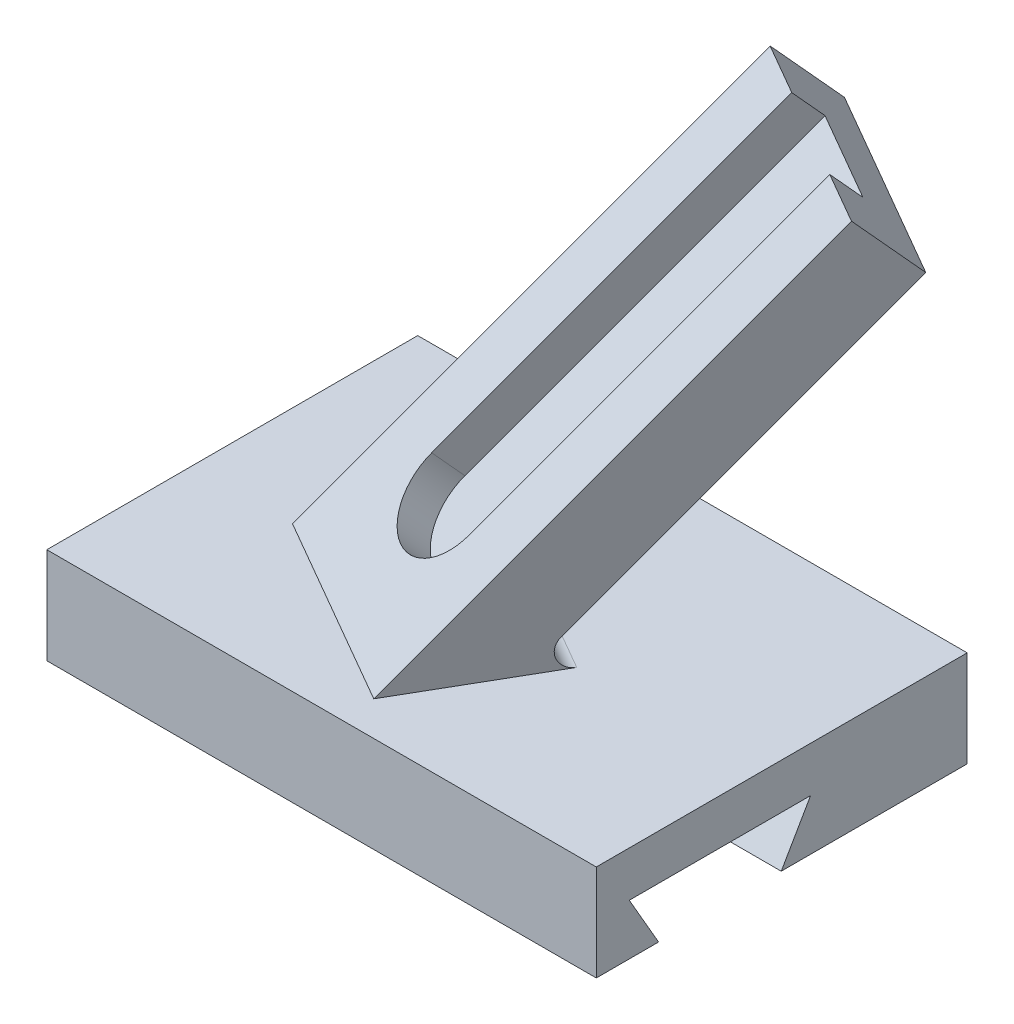
ISO-10303-21;
HEADER;
FILE_DESCRIPTION(('STEP AP214'),'2;1');
FILE_NAME('part.step','',(''),(''),'','','');
FILE_SCHEMA(('AUTOMOTIVE_DESIGN { 1 0 10303 214 1 1 1 1 }'));
ENDSEC;
DATA;
#1=APPLICATION_CONTEXT('core data for automotive mechanical design processes');
#2=APPLICATION_PROTOCOL_DEFINITION('international standard','automotive_design',2000,#1);
#3=PRODUCT_CONTEXT('',#1,'mechanical');
#4=PRODUCT('Part','Part','',(#3));
#5=PRODUCT_RELATED_PRODUCT_CATEGORY('part','',(#4));
#6=PRODUCT_DEFINITION_FORMATION('','',#4);
#7=PRODUCT_DEFINITION_CONTEXT('part definition',#1,'design');
#8=PRODUCT_DEFINITION('design','',#6,#7);
#9=PRODUCT_DEFINITION_SHAPE('','',#8);
#10=(LENGTH_UNIT() NAMED_UNIT(*) SI_UNIT(.MILLI.,.METRE.));
#11=(NAMED_UNIT(*) PLANE_ANGLE_UNIT() SI_UNIT($,.RADIAN.));
#12=(NAMED_UNIT(*) SI_UNIT($,.STERADIAN.) SOLID_ANGLE_UNIT());
#13=UNCERTAINTY_MEASURE_WITH_UNIT(LENGTH_MEASURE(1.E-05),#10,'distance_accuracy_value','');
#14=(GEOMETRIC_REPRESENTATION_CONTEXT(3) GLOBAL_UNCERTAINTY_ASSIGNED_CONTEXT((#13)) GLOBAL_UNIT_ASSIGNED_CONTEXT((#10,
#11,#12)) REPRESENTATION_CONTEXT('',''));
#15=CARTESIAN_POINT('',(0.,0.,0.));
#16=DIRECTION('',(0.,0.,1.));
#17=DIRECTION('',(1.,0.,0.));
#18=AXIS2_PLACEMENT_3D('',#15,#16,#17);
#19=CARTESIAN_POINT('',(0.,0.,0.));
#20=DIRECTION('',(0.,-1.,0.));
#21=DIRECTION('',(0.,0.,-1.));
#22=AXIS2_PLACEMENT_3D('',#19,#20,#21);
#23=PLANE('',#22);
#24=DIRECTION('',(1.,0.,0.));
#25=VECTOR('',#24,1.);
#26=CARTESIAN_POINT('',(0.,0.,-34.1980621701559));
#27=LINE('',#26,#25);
#28=CARTESIAN_POINT('',(0.,0.,-34.1980621701559));
#29=VERTEX_POINT('',#28);
#30=CARTESIAN_POINT('',(101.6,0.,-34.1980621701559));
#31=VERTEX_POINT('',#30);
#32=EDGE_CURVE('E189',#29,#31,#27,.T.);
#33=ORIENTED_EDGE('',*,*,#32,.F.);
#34=DIRECTION('',(0.,0.,1.));
#35=VECTOR('',#34,1.);
#36=CARTESIAN_POINT('',(0.,0.,0.));
#37=LINE('',#36,#35);
#38=CARTESIAN_POINT('',(0.,0.,-68.58));
#39=VERTEX_POINT('',#38);
#40=EDGE_CURVE('E181',#39,#29,#37,.T.);
#41=ORIENTED_EDGE('',*,*,#40,.F.);
#42=DIRECTION('',(-1.,0.,0.));
#43=VECTOR('',#42,1.);
#44=CARTESIAN_POINT('',(0.,0.,-68.58));
#45=LINE('',#44,#43);
#46=CARTESIAN_POINT('',(101.6,0.,-68.58));
#47=VERTEX_POINT('',#46);
#48=EDGE_CURVE('E254',#47,#39,#45,.T.);
#49=ORIENTED_EDGE('',*,*,#48,.F.);
#50=DIRECTION('',(0.,0.,-1.));
#51=VECTOR('',#50,1.);
#52=CARTESIAN_POINT('',(101.6,0.,0.));
#53=LINE('',#52,#51);
#54=EDGE_CURVE('E264',#31,#47,#53,.T.);
#55=ORIENTED_EDGE('',*,*,#54,.F.);
#56=EDGE_LOOP('',(#33,#41,#49,#55));
#57=FACE_BOUND('',#56,.T.);
#58=ADVANCED_FACE('F39',(#57),#23,.T.);
#59=CARTESIAN_POINT('',(0.,17.78,0.));
#60=DIRECTION('',(1.,0.,0.));
#61=DIRECTION('',(0.,0.,-1.));
#62=AXIS2_PLACEMENT_3D('',#59,#60,#61);
#63=PLANE('',#62);
#64=ORIENTED_EDGE('',*,*,#40,.T.);
#65=DIRECTION('',(0.,0.86602540378444,-0.499999999999998));
#66=VECTOR('',#65,1.);
#67=CARTESIAN_POINT('',(0.,0.,-34.1980621701559));
#68=LINE('',#67,#66);
#69=CARTESIAN_POINT('',(0.,9.39800000000001,-39.624));
#70=VERTEX_POINT('',#69);
#71=EDGE_CURVE('E160',#29,#70,#68,.T.);
#72=ORIENTED_EDGE('',*,*,#71,.T.);
#73=DIRECTION('',(0.,0.,1.));
#74=VECTOR('',#73,1.);
#75=CARTESIAN_POINT('',(0.,9.398,-6.09599999999996));
#76=LINE('',#75,#74);
#77=CARTESIAN_POINT('',(0.,9.398,-6.09599999999996));
#78=VERTEX_POINT('',#77);
#79=EDGE_CURVE('E171',#70,#78,#76,.T.);
#80=ORIENTED_EDGE('',*,*,#79,.T.);
#81=DIRECTION('',(0.,-0.86602540378444,-0.499999999999998));
#82=VECTOR('',#81,1.);
#83=CARTESIAN_POINT('',(0.,9.398,-6.09599999999996));
#84=LINE('',#83,#82);
#85=CARTESIAN_POINT('',(0.,0.,-11.521937829844));
#86=VERTEX_POINT('',#85);
#87=EDGE_CURVE('E168',#78,#86,#84,.T.);
#88=ORIENTED_EDGE('',*,*,#87,.T.);
#89=CARTESIAN_POINT('',(0.,0.,0.));
#90=VERTEX_POINT('',#89);
#91=EDGE_CURVE('E248',#86,#90,#37,.T.);
#92=ORIENTED_EDGE('',*,*,#91,.T.);
#93=DIRECTION('',(0.,-1.,0.));
#94=VECTOR('',#93,1.);
#95=CARTESIAN_POINT('',(0.,17.78,0.));
#96=LINE('',#95,#94);
#97=CARTESIAN_POINT('',(0.,17.78,0.));
#98=VERTEX_POINT('',#97);
#99=EDGE_CURVE('E276',#98,#90,#96,.T.);
#100=ORIENTED_EDGE('',*,*,#99,.F.);
#101=DIRECTION('',(0.,0.,1.));
#102=VECTOR('',#101,1.);
#103=CARTESIAN_POINT('',(0.,17.78,0.));
#104=LINE('',#103,#102);
#105=CARTESIAN_POINT('',(0.,17.78,-68.58));
#106=VERTEX_POINT('',#105);
#107=EDGE_CURVE('E250',#106,#98,#104,.T.);
#108=ORIENTED_EDGE('',*,*,#107,.F.);
#109=DIRECTION('',(0.,-1.,0.));
#110=VECTOR('',#109,1.);
#111=CARTESIAN_POINT('',(0.,17.78,-68.58));
#112=LINE('',#111,#110);
#113=EDGE_CURVE('E260',#106,#39,#112,.T.);
#114=ORIENTED_EDGE('',*,*,#113,.T.);
#115=EDGE_LOOP('',(#64,#72,#80,#88,#92,#100,#108,#114));
#116=FACE_BOUND('',#115,.T.);
#117=ADVANCED_FACE('F178',(#116),#63,.F.);
#118=CARTESIAN_POINT('',(0.,17.78,0.));
#119=DIRECTION('',(0.,0.,-1.));
#120=DIRECTION('',(-1.,0.,0.));
#121=AXIS2_PLACEMENT_3D('',#118,#119,#120);
#122=PLANE('',#121);
#123=DIRECTION('',(1.,0.,0.));
#124=VECTOR('',#123,1.);
#125=CARTESIAN_POINT('',(0.,0.,0.));
#126=LINE('',#125,#124);
#127=CARTESIAN_POINT('',(101.6,0.,0.));
#128=VERTEX_POINT('',#127);
#129=EDGE_CURVE('E262',#90,#128,#126,.T.);
#130=ORIENTED_EDGE('',*,*,#129,.T.);
#131=DIRECTION('',(0.,-1.,0.));
#132=VECTOR('',#131,1.);
#133=CARTESIAN_POINT('',(101.6,17.78,0.));
#134=LINE('',#133,#132);
#135=CARTESIAN_POINT('',(101.6,17.78,0.));
#136=VERTEX_POINT('',#135);
#137=EDGE_CURVE('E273',#136,#128,#134,.T.);
#138=ORIENTED_EDGE('',*,*,#137,.F.);
#139=DIRECTION('',(1.,0.,0.));
#140=VECTOR('',#139,1.);
#141=CARTESIAN_POINT('',(0.,17.78,0.));
#142=LINE('',#141,#140);
#143=EDGE_CURVE('E253',#98,#136,#142,.T.);
#144=ORIENTED_EDGE('',*,*,#143,.F.);
#145=ORIENTED_EDGE('',*,*,#99,.T.);
#146=EDGE_LOOP('',(#130,#138,#144,#145));
#147=FACE_BOUND('',#146,.T.);
#148=ADVANCED_FACE('F344',(#147),#122,.F.);
#149=CARTESIAN_POINT('',(101.6,17.78,0.));
#150=DIRECTION('',(-1.,0.,0.));
#151=DIRECTION('',(0.,0.,1.));
#152=AXIS2_PLACEMENT_3D('',#149,#150,#151);
#153=PLANE('',#152);
#154=DIRECTION('',(0.,0.,1.));
#155=VECTOR('',#154,1.);
#156=CARTESIAN_POINT('',(101.6,9.398,-6.096));
#157=LINE('',#156,#155);
#158=CARTESIAN_POINT('',(101.6,9.39800000000001,-39.624));
#159=VERTEX_POINT('',#158);
#160=CARTESIAN_POINT('',(101.6,9.398,-6.096));
#161=VERTEX_POINT('',#160);
#162=EDGE_CURVE('E183',#159,#161,#157,.T.);
#163=ORIENTED_EDGE('',*,*,#162,.F.);
#164=DIRECTION('',(0.,0.86602540378444,-0.499999999999998));
#165=VECTOR('',#164,1.);
#166=CARTESIAN_POINT('',(101.6,0.,-34.1980621701559));
#167=LINE('',#166,#165);
#168=EDGE_CURVE('E163',#31,#159,#167,.T.);
#169=ORIENTED_EDGE('',*,*,#168,.F.);
#170=ORIENTED_EDGE('',*,*,#54,.T.);
#171=DIRECTION('',(0.,-1.,0.));
#172=VECTOR('',#171,1.);
#173=CARTESIAN_POINT('',(101.6,17.78,-68.58));
#174=LINE('',#173,#172);
#175=CARTESIAN_POINT('',(101.6,17.78,-68.58));
#176=VERTEX_POINT('',#175);
#177=EDGE_CURVE('E270',#176,#47,#174,.T.);
#178=ORIENTED_EDGE('',*,*,#177,.F.);
#179=DIRECTION('',(0.,0.,-1.));
#180=VECTOR('',#179,1.);
#181=CARTESIAN_POINT('',(101.6,17.78,0.));
#182=LINE('',#181,#180);
#183=EDGE_CURVE('E256',#136,#176,#182,.T.);
#184=ORIENTED_EDGE('',*,*,#183,.F.);
#185=ORIENTED_EDGE('',*,*,#137,.T.);
#186=CARTESIAN_POINT('',(101.6,0.,-11.5219378298441));
#187=VERTEX_POINT('',#186);
#188=EDGE_CURVE('E265',#128,#187,#53,.T.);
#189=ORIENTED_EDGE('',*,*,#188,.T.);
#190=DIRECTION('',(0.,-0.86602540378444,-0.499999999999998));
#191=VECTOR('',#190,1.);
#192=CARTESIAN_POINT('',(101.6,9.398,-6.096));
#193=LINE('',#192,#191);
#194=EDGE_CURVE('E54',#161,#187,#193,.T.);
#195=ORIENTED_EDGE('',*,*,#194,.F.);
#196=EDGE_LOOP('',(#163,#169,#170,#178,#184,#185,#189,#195));
#197=FACE_BOUND('',#196,.T.);
#198=ADVANCED_FACE('F361',(#197),#153,.F.);
#199=CARTESIAN_POINT('',(0.,17.78,-68.58));
#200=DIRECTION('',(0.,0.,1.));
#201=DIRECTION('',(1.,0.,0.));
#202=AXIS2_PLACEMENT_3D('',#199,#200,#201);
#203=PLANE('',#202);
#204=ORIENTED_EDGE('',*,*,#48,.T.);
#205=ORIENTED_EDGE('',*,*,#113,.F.);
#206=DIRECTION('',(-1.,0.,0.));
#207=VECTOR('',#206,1.);
#208=CARTESIAN_POINT('',(0.,17.78,-68.58));
#209=LINE('',#208,#207);
#210=EDGE_CURVE('E258',#176,#106,#209,.T.);
#211=ORIENTED_EDGE('',*,*,#210,.F.);
#212=ORIENTED_EDGE('',*,*,#177,.T.);
#213=EDGE_LOOP('',(#204,#205,#211,#212));
#214=FACE_BOUND('',#213,.T.);
#215=ADVANCED_FACE('F356',(#214),#203,.F.);
#216=CARTESIAN_POINT('',(0.,17.78,0.));
#217=DIRECTION('',(0.,-1.,0.));
#218=DIRECTION('',(0.,0.,-1.));
#219=AXIS2_PLACEMENT_3D('',#216,#217,#218);
#220=PLANE('',#219);
#221=DIRECTION('',(0.866025403784442,0.,0.499999999999995));
#222=VECTOR('',#221,1.);
#223=CARTESIAN_POINT('',(30.0122789816692,17.78,-51.9827920471833));
#224=LINE('',#223,#222);
#225=CARTESIAN_POINT('',(32.2791483246539,17.78,-50.6740144217933));
#226=VERTEX_POINT('',#225);
#227=CARTESIAN_POINT('',(67.8391483246539,17.78,-30.1434388494105));
#228=VERTEX_POINT('',#227);
#229=EDGE_CURVE('E283',#226,#228,#224,.T.);
#230=ORIENTED_EDGE('',*,*,#229,.T.);
#231=DIRECTION('',(-0.499999999999995,0.,0.866025403784442));
#232=VECTOR('',#231,1.);
#233=CARTESIAN_POINT('',(37.8268693429847,17.78,21.8393531977727));
#234=LINE('',#233,#232);
#235=CARTESIAN_POINT('',(54.102,17.78,-6.35));
#236=VERTEX_POINT('',#235);
#237=EDGE_CURVE('E281',#228,#236,#234,.T.);
#238=ORIENTED_EDGE('',*,*,#237,.T.);
#239=DIRECTION('',(0.866025403784442,0.,0.499999999999995));
#240=VECTOR('',#239,1.);
#241=CARTESIAN_POINT('',(54.102,17.78,-6.35));
#242=LINE('',#241,#240);
#243=CARTESIAN_POINT('',(18.542,17.78,-26.8805755723828));
#244=VERTEX_POINT('',#243);
#245=EDGE_CURVE('E227',#244,#236,#242,.T.);
#246=ORIENTED_EDGE('',*,*,#245,.F.);
#247=DIRECTION('',(0.499999999999995,0.,-0.866025403784442));
#248=VECTOR('',#247,1.);
#249=CARTESIAN_POINT('',(2.26686934298472,17.78,1.30877762538992));
#250=LINE('',#249,#248);
#251=EDGE_CURVE('E279',#244,#226,#250,.T.);
#252=ORIENTED_EDGE('',*,*,#251,.T.);
#253=EDGE_LOOP('',(#230,#238,#246,#252));
#254=FACE_BOUND('',#253,.T.);
#255=ORIENTED_EDGE('',*,*,#107,.T.);
#256=ORIENTED_EDGE('',*,*,#143,.T.);
#257=ORIENTED_EDGE('',*,*,#183,.T.);
#258=ORIENTED_EDGE('',*,*,#210,.T.);
#259=EDGE_LOOP('',(#255,#256,#257,#258));
#260=FACE_BOUND('',#259,.T.);
#261=ADVANCED_FACE('F300',(#254,#260),#220,.F.);
#262=DIRECTION('',(1.,0.,0.));
#263=VECTOR('',#262,1.);
#264=CARTESIAN_POINT('',(0.,0.,-11.521937829844));
#265=LINE('',#264,#263);
#266=EDGE_CURVE('E192',#86,#187,#265,.T.);
#267=ORIENTED_EDGE('',*,*,#266,.T.);
#268=ORIENTED_EDGE('',*,*,#188,.F.);
#269=ORIENTED_EDGE('',*,*,#129,.F.);
#270=ORIENTED_EDGE('',*,*,#91,.F.);
#271=EDGE_LOOP('',(#267,#268,#269,#270));
#272=FACE_BOUND('',#271,.T.);
#273=ADVANCED_FACE('F339',(#272),#23,.T.);
#274=CARTESIAN_POINT('',(91.4598654636472,72.3799572161006,-71.0557210453606));
#275=DIRECTION('',(0.866025403784442,0.,0.499999999999995));
#276=DIRECTION('',(0.499999999999995,0.,-0.866025403784442));
#277=AXIS2_PLACEMENT_3D('',#274,#275,#276);
#278=PLANE('',#277);
#279=ORIENTED_EDGE('',*,*,#237,.F.);
#280=CARTESIAN_POINT('',(67.8391483246539,20.828,-30.1434388494105));
#281=DIRECTION('',(0.866025403784442,0.,0.499999999999995));
#282=DIRECTION('',(0.499999999999995,0.,-0.866025403784442));
#283=AXIS2_PLACEMENT_3D('',#280,#281,#282);
#284=CIRCLE('',#283,3.048);
#285=CARTESIAN_POINT('',(66.7615175901256,22.9832614690566,-28.2769276654097));
#286=VERTEX_POINT('',#285);
#287=EDGE_CURVE('E47',#228,#286,#284,.F.);
#288=ORIENTED_EDGE('',*,*,#287,.T.);
#289=DIRECTION('',(0.353553390593269,0.707106781186549,-0.612372435695796));
#290=VECTOR('',#289,1.);
#291=CARTESIAN_POINT('',(91.4598654636472,72.3799572161006,-71.0557210453606));
#292=LINE('',#291,#290);
#293=CARTESIAN_POINT('',(91.4598654636472,72.3799572161006,-71.0557210453606));
#294=VERTEX_POINT('',#293);
#295=EDGE_CURVE('E224',#286,#294,#292,.T.);
#296=ORIENTED_EDGE('',*,*,#295,.T.);
#297=DIRECTION('',(-0.353553390593271,0.707106781186546,0.612372435695798));
#298=VECTOR('',#297,1.);
#299=CARTESIAN_POINT('',(91.4598654636472,72.3799572161006,-71.0557210453606));
#300=LINE('',#299,#298);
#301=CARTESIAN_POINT('',(86.4309220358485,82.437844071698,-62.3453355200235));
#302=VERTEX_POINT('',#301);
#303=EDGE_CURVE('E233',#294,#302,#300,.T.);
#304=ORIENTED_EDGE('',*,*,#303,.T.);
#305=DIRECTION('',(0.353553390593269,0.707106781186549,-0.612372435695796));
#306=VECTOR('',#305,1.);
#307=CARTESIAN_POINT('',(86.4309220358485,82.437844071698,-62.3453355200235));
#308=LINE('',#307,#306);
#309=EDGE_CURVE('E216',#236,#302,#308,.T.);
#310=ORIENTED_EDGE('',*,*,#309,.F.);
#311=EDGE_LOOP('',(#279,#288,#296,#304,#310));
#312=FACE_BOUND('',#311,.T.);
#313=ADVANCED_FACE('F313',(#312),#278,.T.);
#314=CARTESIAN_POINT('',(23.5709434277987,7.72211314440256,-35.5909610977198));
#315=DIRECTION('',(-0.866025403784442,0.,-0.499999999999995));
#316=DIRECTION('',(-0.499999999999995,0.,0.866025403784442));
#317=AXIS2_PLACEMENT_3D('',#314,#315,#316);
#318=PLANE('',#317);
#319=ORIENTED_EDGE('',*,*,#251,.F.);
#320=DIRECTION('',(-0.353553390593269,-0.707106781186549,0.612372435695796));
#321=VECTOR('',#320,1.);
#322=CARTESIAN_POINT('',(18.542,17.78,-26.8805755723828));
#323=LINE('',#322,#321);
#324=CARTESIAN_POINT('',(50.8709220358486,82.437844071698,-82.8759110924064));
#325=VERTEX_POINT('',#324);
#326=EDGE_CURVE('E240',#325,#244,#323,.T.);
#327=ORIENTED_EDGE('',*,*,#326,.F.);
#328=DIRECTION('',(-0.353553390593271,0.707106781186546,0.612372435695798));
#329=VECTOR('',#328,1.);
#330=CARTESIAN_POINT('',(55.8998654636472,72.3799572161006,-91.5862966177434));
#331=LINE('',#330,#329);
#332=CARTESIAN_POINT('',(55.8998654636472,72.3799572161006,-91.5862966177434));
#333=VERTEX_POINT('',#332);
#334=EDGE_CURVE('E245',#333,#325,#331,.T.);
#335=ORIENTED_EDGE('',*,*,#334,.F.);
#336=DIRECTION('',(-0.353553390593269,-0.707106781186549,0.612372435695796));
#337=VECTOR('',#336,1.);
#338=CARTESIAN_POINT('',(23.5709434277987,7.72211314440256,-35.5909610977198));
#339=LINE('',#338,#337);
#340=CARTESIAN_POINT('',(31.2015175901256,22.9832614690566,-48.8075032377925));
#341=VERTEX_POINT('',#340);
#342=EDGE_CURVE('E230',#333,#341,#339,.T.);
#343=ORIENTED_EDGE('',*,*,#342,.T.);
#344=CARTESIAN_POINT('',(32.2791483246539,20.828,-50.6740144217933));
#345=DIRECTION('',(-0.866025403784442,0.,-0.499999999999995));
#346=DIRECTION('',(-0.499999999999995,0.,0.866025403784442));
#347=AXIS2_PLACEMENT_3D('',#344,#345,#346);
#348=CIRCLE('',#347,3.048);
#349=EDGE_CURVE('E11',#341,#226,#348,.F.);
#350=ORIENTED_EDGE('',*,*,#349,.T.);
#351=EDGE_LOOP('',(#319,#327,#335,#343,#350));
#352=FACE_BOUND('',#351,.T.);
#353=ADVANCED_FACE('F296',(#352),#318,.T.);
#354=CARTESIAN_POINT('',(8.72150875630641,-17.4430175126129,-15.1060962845798));
#355=DIRECTION('',(0.353553390593271,-0.707106781186546,-0.612372435695798));
#356=DIRECTION('',(0.,0.65465367070798,-0.755928946018452));
#357=AXIS2_PLACEMENT_3D('',#354,#355,#356);
#358=PLANE('',#357);
#359=ORIENTED_EDGE('',*,*,#295,.F.);
#360=DIRECTION('',(0.866025403784442,0.,0.499999999999995));
#361=VECTOR('',#360,1.);
#362=CARTESIAN_POINT('',(28.9346482471409,22.9832614690566,-50.1162808631825));
#363=LINE('',#362,#361);
#364=EDGE_CURVE('E286',#286,#341,#363,.F.);
#365=ORIENTED_EDGE('',*,*,#364,.T.);
#366=ORIENTED_EDGE('',*,*,#342,.F.);
#367=DIRECTION('',(-0.866025403784441,0.,-0.499999999999995));
#368=VECTOR('',#367,1.);
#369=CARTESIAN_POINT('',(55.8998654636472,72.3799572161006,-91.5862966177434));
#370=LINE('',#369,#368);
#371=EDGE_CURVE('E226',#294,#333,#370,.T.);
#372=ORIENTED_EDGE('',*,*,#371,.F.);
#373=EDGE_LOOP('',(#359,#365,#366,#372));
#374=FACE_BOUND('',#373,.T.);
#375=ADVANCED_FACE('F290',(#374),#358,.T.);
#376=CARTESIAN_POINT('',(55.8998654636472,72.3799572161006,-91.5862966177434));
#377=DIRECTION('',(0.35355339059327,0.707106781186549,-0.612372435695795));
#378=DIRECTION('',(0.,0.654653670707977,0.755928946018455));
#379=AXIS2_PLACEMENT_3D('',#376,#377,#378);
#380=PLANE('',#379);
#381=DIRECTION('',(-0.353553390593271,0.707106781186546,0.612372435695798));
#382=VECTOR('',#381,1.);
#383=CARTESIAN_POINT('',(62.5903933474472,77.9477160111635,-81.2944244647859));
#384=LINE('',#383,#382);
#385=CARTESIAN_POINT('',(62.5903933474472,77.9477160111635,-81.2944244647859));
#386=VERTEX_POINT('',#385);
#387=CARTESIAN_POINT('',(60.3453293171799,82.4378440716981,-77.4058594981176));
#388=VERTEX_POINT('',#387);
#389=EDGE_CURVE('E214',#386,#388,#384,.T.);
#390=ORIENTED_EDGE('',*,*,#389,.F.);
#391=DIRECTION('',(-0.866025403784442,0.,-0.499999999999995));
#392=VECTOR('',#391,1.);
#393=CARTESIAN_POINT('',(50.8491167231311,77.9477160111635,-88.0732536844646));
#394=LINE('',#393,#392);
#395=CARTESIAN_POINT('',(79.2015787847844,77.9477160111635,-71.7039520809806));
#396=VERTEX_POINT('',#395);
#397=EDGE_CURVE('E204',#396,#386,#394,.T.);
#398=ORIENTED_EDGE('',*,*,#397,.F.);
#399=DIRECTION('',(-0.353553390593271,0.707106781186546,0.612372435695798));
#400=VECTOR('',#399,1.);
#401=CARTESIAN_POINT('',(79.2015787847844,77.9477160111635,-71.7039520809806));
#402=LINE('',#401,#400);
#403=CARTESIAN_POINT('',(76.9565147545172,82.4378440716981,-67.8153871143123));
#404=VERTEX_POINT('',#403);
#405=EDGE_CURVE('E217',#396,#404,#402,.T.);
#406=ORIENTED_EDGE('',*,*,#405,.T.);
#407=DIRECTION('',(-0.866025403784441,0.,-0.499999999999995));
#408=VECTOR('',#407,1.);
#409=CARTESIAN_POINT('',(50.8709220358486,82.437844071698,-82.8759110924064));
#410=LINE('',#409,#408);
#411=EDGE_CURVE('E237',#302,#404,#410,.T.);
#412=ORIENTED_EDGE('',*,*,#411,.F.);
#413=ORIENTED_EDGE('',*,*,#303,.F.);
#414=ORIENTED_EDGE('',*,*,#371,.T.);
#415=ORIENTED_EDGE('',*,*,#334,.T.);
#416=EDGE_CURVE('E236',#388,#325,#410,.T.);
#417=ORIENTED_EDGE('',*,*,#416,.F.);
#418=EDGE_LOOP('',(#390,#398,#406,#412,#413,#414,#415,#417));
#419=FACE_BOUND('',#418,.T.);
#420=ADVANCED_FACE('F310',(#419),#380,.T.);
#421=CARTESIAN_POINT('',(3.69256532850772,-7.3851306570155,-6.39571075924273));
#422=DIRECTION('',(0.353553390593271,-0.707106781186546,-0.612372435695798));
#423=DIRECTION('',(0.,0.65465367070798,-0.755928946018452));
#424=AXIS2_PLACEMENT_3D('',#421,#422,#423);
#425=PLANE('',#424);
#426=CARTESIAN_POINT('',(44.2787954673866,33.6935909347734,-30.3968618011389));
#427=DIRECTION('',(-0.353553390593271,0.707106781186546,0.612372435695798));
#428=DIRECTION('',(0.,-0.65465367070798,0.755928946018452));
#429=AXIS2_PLACEMENT_3D('',#426,#427,#428);
#430=CIRCLE('',#429,9.59047238380541);
#431=CARTESIAN_POINT('',(35.9732027487179,33.6935909347734,-35.1920979930416));
#432=VERTEX_POINT('',#431);
#433=CARTESIAN_POINT('',(52.5843881860552,33.6935909347734,-25.6016256092363));
#434=VERTEX_POINT('',#433);
#435=EDGE_CURVE('E209',#432,#434,#430,.T.);
#436=ORIENTED_EDGE('',*,*,#435,.F.);
#437=DIRECTION('',(-0.35355339059327,-0.707106781186549,0.612372435695795));
#438=VECTOR('',#437,1.);
#439=CARTESIAN_POINT('',(15.4338419528238,-7.3851306570155,0.383118460435912));
#440=LINE('',#439,#438);
#441=EDGE_CURVE('E191',#388,#432,#440,.T.);
#442=ORIENTED_EDGE('',*,*,#441,.F.);
#443=ORIENTED_EDGE('',*,*,#416,.T.);
#444=ORIENTED_EDGE('',*,*,#326,.T.);
#445=ORIENTED_EDGE('',*,*,#245,.T.);
#446=ORIENTED_EDGE('',*,*,#309,.T.);
#447=ORIENTED_EDGE('',*,*,#411,.T.);
#448=DIRECTION('',(-0.353553390593269,-0.707106781186549,0.612372435695795));
#449=VECTOR('',#448,1.);
#450=CARTESIAN_POINT('',(32.045027390161,-7.3851306570155,9.97359084424122));
#451=LINE('',#450,#449);
#452=EDGE_CURVE('E199',#404,#434,#451,.T.);
#453=ORIENTED_EDGE('',*,*,#452,.T.);
#454=EDGE_LOOP('',(#436,#442,#443,#444,#445,#446,#447,#453));
#455=FACE_BOUND('',#454,.T.);
#456=ADVANCED_FACE('F305',(#455),#425,.F.);
#457=CARTESIAN_POINT('',(17.6789059830911,-11.8752587175501,-3.50544650623241));
#458=DIRECTION('',(-0.866025403784442,0.,-0.499999999999995));
#459=DIRECTION('',(-0.499999999999995,0.,0.866025403784442));
#460=AXIS2_PLACEMENT_3D('',#457,#458,#459);
#461=PLANE('',#460);
#462=ORIENTED_EDGE('',*,*,#441,.T.);
#463=DIRECTION('',(-0.353553390593271,0.707106781186546,0.612372435695798));
#464=VECTOR('',#463,1.);
#465=CARTESIAN_POINT('',(38.2182667789852,29.2034628742388,-39.0806629597099));
#466=LINE('',#465,#464);
#467=CARTESIAN_POINT('',(38.2182667789852,29.2034628742388,-39.0806629597099));
#468=VERTEX_POINT('',#467);
#469=EDGE_CURVE('E207',#468,#432,#466,.T.);
#470=ORIENTED_EDGE('',*,*,#469,.F.);
#471=DIRECTION('',(-0.35355339059327,-0.707106781186549,0.612372435695795));
#472=VECTOR('',#471,1.);
#473=CARTESIAN_POINT('',(17.6789059830911,-11.8752587175501,-3.50544650623241));
#474=LINE('',#473,#472);
#475=EDGE_CURVE('E195',#386,#468,#474,.T.);
#476=ORIENTED_EDGE('',*,*,#475,.F.);
#477=ORIENTED_EDGE('',*,*,#389,.T.);
#478=EDGE_LOOP('',(#462,#470,#476,#477));
#479=FACE_BOUND('',#478,.T.);
#480=ADVANCED_FACE('F325',(#479),#461,.F.);
#481=CARTESIAN_POINT('',(34.2900914204283,-11.8752587175501,6.08502587757291));
#482=DIRECTION('',(-0.866025403784442,0.,-0.499999999999995));
#483=DIRECTION('',(-0.499999999999995,0.,0.866025403784442));
#484=AXIS2_PLACEMENT_3D('',#481,#482,#483);
#485=PLANE('',#484);
#486=ORIENTED_EDGE('',*,*,#452,.F.);
#487=ORIENTED_EDGE('',*,*,#405,.F.);
#488=DIRECTION('',(-0.353553390593269,-0.707106781186549,0.612372435695795));
#489=VECTOR('',#488,1.);
#490=CARTESIAN_POINT('',(34.2900914204283,-11.8752587175501,6.08502587757291));
#491=LINE('',#490,#489);
#492=CARTESIAN_POINT('',(54.8294522163225,29.2034628742388,-29.4901905759046));
#493=VERTEX_POINT('',#492);
#494=EDGE_CURVE('E202',#396,#493,#491,.T.);
#495=ORIENTED_EDGE('',*,*,#494,.T.);
#496=DIRECTION('',(-0.353553390593271,0.707106781186546,0.612372435695798));
#497=VECTOR('',#496,1.);
#498=CARTESIAN_POINT('',(54.8294522163225,29.2034628742388,-29.4901905759046));
#499=LINE('',#498,#497);
#500=EDGE_CURVE('E220',#493,#434,#499,.T.);
#501=ORIENTED_EDGE('',*,*,#500,.T.);
#502=EDGE_LOOP('',(#486,#487,#495,#501));
#503=FACE_BOUND('',#502,.T.);
#504=ADVANCED_FACE('F315',(#503),#485,.T.);
#505=CARTESIAN_POINT('',(46.5238594976538,29.2034628742388,-34.2854267678073));
#506=DIRECTION('',(-0.353553390593271,0.707106781186546,0.612372435695798));
#507=DIRECTION('',(0.,-0.65465367070798,0.755928946018452));
#508=AXIS2_PLACEMENT_3D('',#505,#506,#507);
#509=CYLINDRICAL_SURFACE('',#508,9.59047238380541);
#510=ORIENTED_EDGE('',*,*,#435,.T.);
#511=ORIENTED_EDGE('',*,*,#500,.F.);
#512=CARTESIAN_POINT('',(46.5238594976538,29.2034628742388,-34.2854267678073));
#513=DIRECTION('',(-0.353553390593271,0.707106781186546,0.612372435695798));
#514=DIRECTION('',(0.,-0.65465367070798,0.755928946018452));
#515=AXIS2_PLACEMENT_3D('',#512,#513,#514);
#516=CIRCLE('',#515,9.59047238380541);
#517=EDGE_CURVE('E198',#468,#493,#516,.T.);
#518=ORIENTED_EDGE('',*,*,#517,.F.);
#519=ORIENTED_EDGE('',*,*,#469,.T.);
#520=EDGE_LOOP('',(#510,#511,#518,#519));
#521=FACE_BOUND('',#520,.T.);
#522=ADVANCED_FACE('F323',(#521),#509,.F.);
#523=CARTESIAN_POINT('',(5.937629358775,-11.8752587175501,-10.2842757259111));
#524=DIRECTION('',(-0.353553390593271,0.707106781186546,0.612372435695798));
#525=DIRECTION('',(0.,-0.65465367070798,0.755928946018452));
#526=AXIS2_PLACEMENT_3D('',#523,#524,#525);
#527=PLANE('',#526);
#528=ORIENTED_EDGE('',*,*,#475,.T.);
#529=ORIENTED_EDGE('',*,*,#517,.T.);
#530=ORIENTED_EDGE('',*,*,#494,.F.);
#531=ORIENTED_EDGE('',*,*,#397,.T.);
#532=EDGE_LOOP('',(#528,#529,#530,#531));
#533=FACE_BOUND('',#532,.T.);
#534=ADVANCED_FACE('F320',(#533),#527,.T.);
#535=CARTESIAN_POINT('',(30.0122789816692,20.828,-51.9827920471833));
#536=DIRECTION('',(0.866025403784442,0.,0.499999999999995));
#537=DIRECTION('',(0.499999999999995,0.,-0.866025403784442));
#538=AXIS2_PLACEMENT_3D('',#535,#536,#537);
#539=CYLINDRICAL_SURFACE('',#538,3.048);
#540=ORIENTED_EDGE('',*,*,#349,.F.);
#541=ORIENTED_EDGE('',*,*,#364,.F.);
#542=ORIENTED_EDGE('',*,*,#287,.F.);
#543=ORIENTED_EDGE('',*,*,#229,.F.);
#544=EDGE_LOOP('',(#540,#541,#542,#543));
#545=FACE_BOUND('',#544,.T.);
#546=ADVANCED_FACE('F41',(#545),#539,.F.);
#547=CARTESIAN_POINT('',(0.,0.,-34.1980621701559));
#548=DIRECTION('',(0.,-0.499999999999998,-0.86602540378444));
#549=DIRECTION('',(0.,0.86602540378444,-0.499999999999998));
#550=AXIS2_PLACEMENT_3D('',#547,#548,#549);
#551=PLANE('',#550);
#552=ORIENTED_EDGE('',*,*,#168,.T.);
#553=DIRECTION('',(1.,0.,0.));
#554=VECTOR('',#553,1.);
#555=CARTESIAN_POINT('',(0.,9.39800000000001,-39.624));
#556=LINE('',#555,#554);
#557=EDGE_CURVE('E156',#70,#159,#556,.T.);
#558=ORIENTED_EDGE('',*,*,#557,.F.);
#559=ORIENTED_EDGE('',*,*,#71,.F.);
#560=ORIENTED_EDGE('',*,*,#32,.T.);
#561=EDGE_LOOP('',(#552,#558,#559,#560));
#562=FACE_BOUND('',#561,.T.);
#563=ADVANCED_FACE('F158',(#562),#551,.F.);
#564=CARTESIAN_POINT('',(0.,9.398,-6.09599999999996));
#565=DIRECTION('',(0.,-0.499999999999998,0.86602540378444));
#566=DIRECTION('',(0.,-0.86602540378444,-0.499999999999998));
#567=AXIS2_PLACEMENT_3D('',#564,#565,#566);
#568=PLANE('',#567);
#569=ORIENTED_EDGE('',*,*,#194,.T.);
#570=ORIENTED_EDGE('',*,*,#266,.F.);
#571=ORIENTED_EDGE('',*,*,#87,.F.);
#572=DIRECTION('',(1.,0.,0.));
#573=VECTOR('',#572,1.);
#574=CARTESIAN_POINT('',(0.,9.398,-6.09599999999996));
#575=LINE('',#574,#573);
#576=EDGE_CURVE('E167',#78,#161,#575,.T.);
#577=ORIENTED_EDGE('',*,*,#576,.T.);
#578=EDGE_LOOP('',(#569,#570,#571,#577));
#579=FACE_BOUND('',#578,.T.);
#580=ADVANCED_FACE('F368',(#579),#568,.F.);
#581=CARTESIAN_POINT('',(0.,9.398,-6.09599999999996));
#582=DIRECTION('',(0.,1.,0.));
#583=DIRECTION('',(0.,0.,1.));
#584=AXIS2_PLACEMENT_3D('',#581,#582,#583);
#585=PLANE('',#584);
#586=ORIENTED_EDGE('',*,*,#162,.T.);
#587=ORIENTED_EDGE('',*,*,#576,.F.);
#588=ORIENTED_EDGE('',*,*,#79,.F.);
#589=ORIENTED_EDGE('',*,*,#557,.T.);
#590=EDGE_LOOP('',(#586,#587,#588,#589));
#591=FACE_BOUND('',#590,.T.);
#592=ADVANCED_FACE('F172',(#591),#585,.F.);
#593=CLOSED_SHELL('',(#58,#117,#148,#198,#215,#261,#273,#313,#353,#375,#420,#456,#480,#504,#522,
#534,#546,#563,#580,#592));
#594=MANIFOLD_SOLID_BREP('B2',#593);
#595=ADVANCED_BREP_SHAPE_REPRESENTATION('',(#18,#594),#14);
#596=SHAPE_DEFINITION_REPRESENTATION(#9,#595);
ENDSEC;
END-ISO-10303-21;
